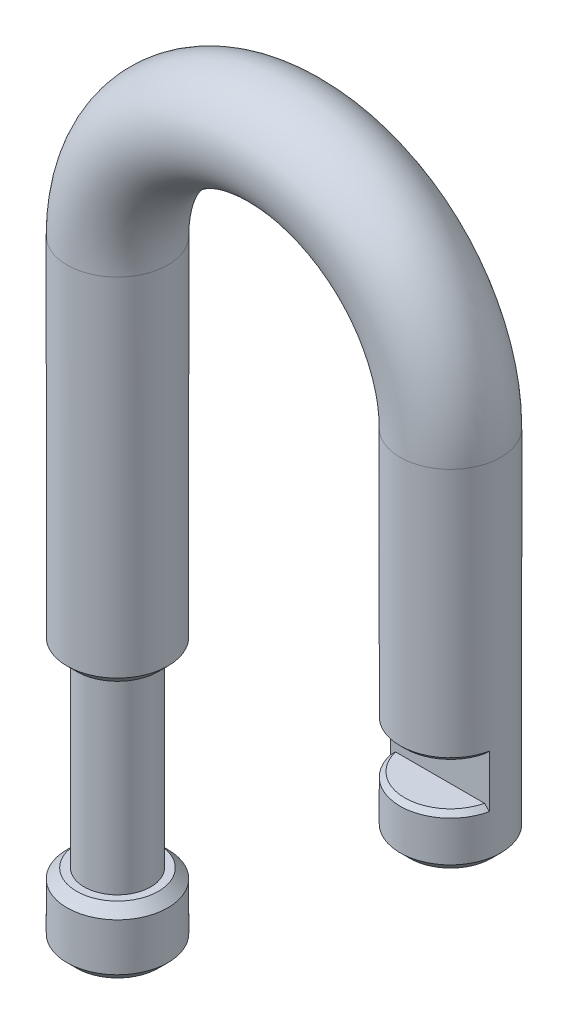
ISO-10303-21;
HEADER;
FILE_DESCRIPTION(('STEP AP214'),'2;1');
FILE_NAME('part.step','',(''),(''),'','','');
FILE_SCHEMA(('AUTOMOTIVE_DESIGN { 1 0 10303 214 1 1 1 1 }'));
ENDSEC;
DATA;
#1=APPLICATION_CONTEXT('core data for automotive mechanical design processes');
#2=APPLICATION_PROTOCOL_DEFINITION('international standard','automotive_design',2000,#1);
#3=PRODUCT_CONTEXT('',#1,'mechanical');
#4=PRODUCT('Part','Part','',(#3));
#5=PRODUCT_RELATED_PRODUCT_CATEGORY('part','',(#4));
#6=PRODUCT_DEFINITION_FORMATION('','',#4);
#7=PRODUCT_DEFINITION_CONTEXT('part definition',#1,'design');
#8=PRODUCT_DEFINITION('design','',#6,#7);
#9=PRODUCT_DEFINITION_SHAPE('','',#8);
#10=(LENGTH_UNIT() NAMED_UNIT(*) SI_UNIT(.MILLI.,.METRE.));
#11=(NAMED_UNIT(*) PLANE_ANGLE_UNIT() SI_UNIT($,.RADIAN.));
#12=(NAMED_UNIT(*) SI_UNIT($,.STERADIAN.) SOLID_ANGLE_UNIT());
#13=UNCERTAINTY_MEASURE_WITH_UNIT(LENGTH_MEASURE(1.E-05),#10,'distance_accuracy_value','');
#14=(GEOMETRIC_REPRESENTATION_CONTEXT(3) GLOBAL_UNCERTAINTY_ASSIGNED_CONTEXT((#13)) GLOBAL_UNIT_ASSIGNED_CONTEXT((#10,
#11,#12)) REPRESENTATION_CONTEXT('',''));
#15=CARTESIAN_POINT('',(0.,0.,0.));
#16=DIRECTION('',(0.,0.,1.));
#17=DIRECTION('',(1.,0.,0.));
#18=AXIS2_PLACEMENT_3D('',#15,#16,#17);
#19=CARTESIAN_POINT('',(0.,0.,0.));
#20=DIRECTION('',(0.,1.,0.));
#21=DIRECTION('',(-1.,0.,0.));
#22=AXIS2_PLACEMENT_3D('',#19,#20,#21);
#23=CYLINDRICAL_SURFACE('',#22,5.3);
#24=CARTESIAN_POINT('',(0.,28.,0.));
#25=DIRECTION('',(0.,-1.,0.));
#26=DIRECTION('',(1.,0.,0.));
#27=AXIS2_PLACEMENT_3D('',#24,#25,#26);
#28=CIRCLE('',#27,5.3);
#29=CARTESIAN_POINT('',(5.29999999999999,28.,0.));
#30=VERTEX_POINT('',#29);
#31=EDGE_CURVE('E163',#30,#30,#28,.F.);
#32=ORIENTED_EDGE('',*,*,#31,.T.);
#33=EDGE_LOOP('',(#32));
#34=FACE_BOUND('',#33,.T.);
#35=CARTESIAN_POINT('',(0.,64.5,0.));
#36=DIRECTION('',(0.,1.,0.));
#37=DIRECTION('',(0.,0.,1.));
#38=AXIS2_PLACEMENT_3D('',#35,#36,#37);
#39=CIRCLE('',#38,5.3);
#40=CARTESIAN_POINT('',(-5.30000000000001,64.5,0.));
#41=VERTEX_POINT('',#40);
#42=EDGE_CURVE('E130',#41,#41,#39,.T.);
#43=ORIENTED_EDGE('',*,*,#42,.F.);
#44=EDGE_LOOP('',(#43));
#45=FACE_BOUND('',#44,.T.);
#46=ADVANCED_FACE('F46',(#34,#45),#23,.T.);
#47=CARTESIAN_POINT('',(35.,64.5,0.));
#48=DIRECTION('',(0.,-1.,0.));
#49=DIRECTION('',(1.,0.,0.));
#50=AXIS2_PLACEMENT_3D('',#47,#48,#49);
#51=CYLINDRICAL_SURFACE('',#50,5.3);
#52=CARTESIAN_POINT('',(35.,28.5,0.));
#53=DIRECTION('',(0.,-1.,0.));
#54=DIRECTION('',(0.,0.,-1.));
#55=AXIS2_PLACEMENT_3D('',#52,#53,#54);
#56=CIRCLE('',#55,5.3);
#57=CARTESIAN_POINT('',(35.,28.5,-5.3));
#58=VERTEX_POINT('',#57);
#59=EDGE_CURVE('E143',#58,#58,#56,.F.);
#60=ORIENTED_EDGE('',*,*,#59,.T.);
#61=EDGE_LOOP('',(#60));
#62=FACE_BOUND('',#61,.T.);
#63=CARTESIAN_POINT('',(35.,64.5,0.));
#64=DIRECTION('',(0.,-1.,0.));
#65=DIRECTION('',(0.,0.,1.));
#66=AXIS2_PLACEMENT_3D('',#63,#64,#65);
#67=CIRCLE('',#66,5.3);
#68=CARTESIAN_POINT('',(40.3,64.5,0.));
#69=VERTEX_POINT('',#68);
#70=EDGE_CURVE('E135',#69,#69,#67,.T.);
#71=ORIENTED_EDGE('',*,*,#70,.T.);
#72=EDGE_LOOP('',(#71));
#73=FACE_BOUND('',#72,.T.);
#74=DIRECTION('',(0.,-1.,0.));
#75=VECTOR('',#74,1.);
#76=CARTESIAN_POINT('',(29.8154074412737,37.7499999999999,1.1));
#77=LINE('',#76,#75);
#78=CARTESIAN_POINT('',(29.8154074412737,38.2499999999999,1.1));
#79=VERTEX_POINT('',#78);
#80=CARTESIAN_POINT('',(29.8154074412737,32.7499999999999,1.1));
#81=VERTEX_POINT('',#80);
#82=EDGE_CURVE('E121',#79,#81,#77,.T.);
#83=ORIENTED_EDGE('',*,*,#82,.F.);
#84=CARTESIAN_POINT('',(35.,38.2499999999999,0.));
#85=DIRECTION('',(0.,-1.,0.));
#86=DIRECTION('',(0.,0.,-1.));
#87=AXIS2_PLACEMENT_3D('',#84,#85,#86);
#88=CIRCLE('',#87,5.3);
#89=CARTESIAN_POINT('',(40.1845925587263,38.2499999999999,1.1));
#90=VERTEX_POINT('',#89);
#91=EDGE_CURVE('E101',#79,#90,#88,.F.);
#92=ORIENTED_EDGE('',*,*,#91,.T.);
#93=DIRECTION('',(0.,-1.,0.));
#94=VECTOR('',#93,1.);
#95=CARTESIAN_POINT('',(40.1845925587263,37.7499999999999,1.1));
#96=LINE('',#95,#94);
#97=CARTESIAN_POINT('',(40.1845925587263,32.7499999999999,1.1));
#98=VERTEX_POINT('',#97);
#99=EDGE_CURVE('E116',#90,#98,#96,.T.);
#100=ORIENTED_EDGE('',*,*,#99,.T.);
#101=CARTESIAN_POINT('',(35.,32.7499999999999,0.));
#102=DIRECTION('',(0.,-1.,0.));
#103=DIRECTION('',(0.,0.,-1.));
#104=AXIS2_PLACEMENT_3D('',#101,#102,#103);
#105=CIRCLE('',#104,5.3);
#106=EDGE_CURVE('E111',#98,#81,#105,.T.);
#107=ORIENTED_EDGE('',*,*,#106,.T.);
#108=EDGE_LOOP('',(#83,#92,#100,#107));
#109=FACE_BOUND('',#108,.T.);
#110=ADVANCED_FACE('F233',(#62,#73,#109),#51,.T.);
#111=CARTESIAN_POINT('',(35.,27.5,0.));
#112=DIRECTION('',(0.,-1.,0.));
#113=DIRECTION('',(0.,0.,1.));
#114=AXIS2_PLACEMENT_3D('',#111,#112,#113);
#115=PLANE('',#114);
#116=CARTESIAN_POINT('',(35.,27.5,0.));
#117=DIRECTION('',(0.,-1.,0.));
#118=DIRECTION('',(1.,0.,0.));
#119=AXIS2_PLACEMENT_3D('',#116,#117,#118);
#120=CIRCLE('',#119,4.29999999999999);
#121=CARTESIAN_POINT('',(39.3,27.5,0.));
#122=VERTEX_POINT('',#121);
#123=EDGE_CURVE('E139',#122,#122,#120,.T.);
#124=ORIENTED_EDGE('',*,*,#123,.T.);
#125=EDGE_LOOP('',(#124));
#126=FACE_BOUND('',#125,.T.);
#127=ADVANCED_FACE('F229',(#126),#115,.T.);
#128=CARTESIAN_POINT('',(17.5,64.5,0.));
#129=DIRECTION('',(0.,0.,-1.));
#130=DIRECTION('',(-1.,0.,0.));
#131=AXIS2_PLACEMENT_3D('',#128,#129,#130);
#132=TOROIDAL_SURFACE('',#131,17.5,5.3);
#133=CARTESIAN_POINT('',(17.5,64.5,0.));
#134=DIRECTION('',(0.,0.,-1.));
#135=DIRECTION('',(-1.,0.,0.));
#136=AXIS2_PLACEMENT_3D('',#133,#134,#135);
#137=CIRCLE('',#136,22.8);
#138=EDGE_CURVE('',#41,#69,#137,.T.);
#139=ORIENTED_EDGE('',*,*,#42,.T.);
#140=ORIENTED_EDGE('',*,*,#70,.F.);
#141=ORIENTED_EDGE('',*,*,#138,.T.);
#142=ORIENTED_EDGE('',*,*,#138,.F.);
#143=EDGE_LOOP('',(#139,#141,#140,#142));
#144=FACE_BOUND('',#143,.T.);
#145=ADVANCED_FACE('F232',(#144),#132,.T.);
#146=CARTESIAN_POINT('',(0.,37.75,1.1));
#147=DIRECTION('',(0.,0.,-1.));
#148=DIRECTION('',(-1.,0.,0.));
#149=AXIS2_PLACEMENT_3D('',#146,#147,#148);
#150=PLANE('',#149);
#151=ORIENTED_EDGE('',*,*,#82,.T.);
#152=CARTESIAN_POINT('',(29.8154074412737,32.7499999999999,1.1));
#153=CARTESIAN_POINT('',(29.9006934499817,32.8334388627094,1.1));
#154=CARTESIAN_POINT('',(29.9860309538806,32.9168249599442,1.1));
#155=CARTESIAN_POINT('',(30.156808955289,33.0834916266148,1.1));
#156=CARTESIAN_POINT('',(30.2422494528023,33.1667721960468,1.1));
#157=CARTESIAN_POINT('',(30.3277414455105,33.2499999999999,1.1));
#158=B_SPLINE_CURVE_WITH_KNOTS('',3,(#152,#153,#154,#155,#156,#157),.UNSPECIFIED.,.F.,.F.,(4,2,
4),(0.,0.35794074517115,0.715881503875867),.UNSPECIFIED.);
#159=CARTESIAN_POINT('',(30.3277414455105,33.2499999999999,1.1));
#160=VERTEX_POINT('',#159);
#161=EDGE_CURVE('E62',#81,#160,#158,.T.);
#162=ORIENTED_EDGE('',*,*,#161,.T.);
#163=DIRECTION('',(1.,0.,0.));
#164=VECTOR('',#163,1.);
#165=CARTESIAN_POINT('',(0.,33.25,1.1));
#166=LINE('',#165,#164);
#167=CARTESIAN_POINT('',(39.6722585544895,33.2499999999999,1.1));
#168=VERTEX_POINT('',#167);
#169=EDGE_CURVE('E117',#160,#168,#166,.T.);
#170=ORIENTED_EDGE('',*,*,#169,.T.);
#171=CARTESIAN_POINT('',(39.6722585544895,33.2499999999999,1.1));
#172=CARTESIAN_POINT('',(39.7577505471977,33.1667721960468,1.1));
#173=CARTESIAN_POINT('',(39.843191044711,33.0834916266148,1.1));
#174=CARTESIAN_POINT('',(40.0139690461194,32.9168249599442,1.1));
#175=CARTESIAN_POINT('',(40.0993065500183,32.8334388627094,1.1));
#176=CARTESIAN_POINT('',(40.1845925587263,32.7499999999999,1.1));
#177=B_SPLINE_CURVE_WITH_KNOTS('',3,(#171,#172,#173,#174,#175,#176),.UNSPECIFIED.,.F.,.F.,(4,2,
4),(0.,0.357940758704703,0.715881503875852),.UNSPECIFIED.);
#178=EDGE_CURVE('E11',#168,#98,#177,.T.);
#179=ORIENTED_EDGE('',*,*,#178,.T.);
#180=ORIENTED_EDGE('',*,*,#99,.F.);
#181=CARTESIAN_POINT('',(40.1845925587263,38.2499999999999,1.09999999999999));
#182=CARTESIAN_POINT('',(40.0993065500183,38.1665611372904,1.1));
#183=CARTESIAN_POINT('',(40.0139690461194,38.0831750400557,1.1));
#184=CARTESIAN_POINT('',(39.843191044711,37.916508373385,1.1));
#185=CARTESIAN_POINT('',(39.7577505471977,37.8332278039531,1.1));
#186=CARTESIAN_POINT('',(39.6722585544895,37.7499999999999,1.1));
#187=B_SPLINE_CURVE_WITH_KNOTS('',3,(#181,#182,#183,#184,#185,#186),.UNSPECIFIED.,.F.,.F.,(4,2,
4),(0.,0.357940745171125,0.715881503875813),.UNSPECIFIED.);
#188=CARTESIAN_POINT('',(39.6722585544895,37.7499999999999,1.1));
#189=VERTEX_POINT('',#188);
#190=EDGE_CURVE('E104',#90,#189,#187,.T.);
#191=ORIENTED_EDGE('',*,*,#190,.T.);
#192=DIRECTION('',(1.,0.,0.));
#193=VECTOR('',#192,1.);
#194=CARTESIAN_POINT('',(0.,37.75,1.1));
#195=LINE('',#194,#193);
#196=CARTESIAN_POINT('',(30.3277414455105,37.7499999999999,1.1));
#197=VERTEX_POINT('',#196);
#198=EDGE_CURVE('E109',#197,#189,#195,.T.);
#199=ORIENTED_EDGE('',*,*,#198,.F.);
#200=CARTESIAN_POINT('',(30.3277414455105,37.7499999999999,1.1));
#201=CARTESIAN_POINT('',(30.2422494528023,37.8332278039531,1.1));
#202=CARTESIAN_POINT('',(30.156808955289,37.916508373385,1.1));
#203=CARTESIAN_POINT('',(29.9860309538806,38.0831750400557,1.1));
#204=CARTESIAN_POINT('',(29.9006934499817,38.1665611372904,1.1));
#205=CARTESIAN_POINT('',(29.8154074412737,38.2499999999999,1.1));
#206=B_SPLINE_CURVE_WITH_KNOTS('',3,(#200,#201,#202,#203,#204,#205),.UNSPECIFIED.,.F.,.F.,(4,2,
4),(0.,0.357940758704681,0.715881503875804),.UNSPECIFIED.);
#207=EDGE_CURVE('E95',#197,#79,#206,.T.);
#208=ORIENTED_EDGE('',*,*,#207,.T.);
#209=EDGE_LOOP('',(#151,#162,#170,#179,#180,#191,#199,#208));
#210=FACE_BOUND('',#209,.T.);
#211=ADVANCED_FACE('F114',(#210),#150,.F.);
#212=CARTESIAN_POINT('',(0.,37.75,0.));
#213=DIRECTION('',(0.,-1.,0.));
#214=DIRECTION('',(1.,0.,0.));
#215=AXIS2_PLACEMENT_3D('',#212,#213,#214);
#216=PLANE('',#215);
#217=ORIENTED_EDGE('',*,*,#198,.T.);
#218=CARTESIAN_POINT('',(35.,37.7499999999999,0.));
#219=DIRECTION('',(0.,-1.,0.));
#220=DIRECTION('',(1.,0.,0.));
#221=AXIS2_PLACEMENT_3D('',#218,#219,#220);
#222=CIRCLE('',#221,4.80000000000004);
#223=EDGE_CURVE('E99',#189,#197,#222,.T.);
#224=ORIENTED_EDGE('',*,*,#223,.T.);
#225=EDGE_LOOP('',(#217,#224));
#226=FACE_BOUND('',#225,.T.);
#227=ADVANCED_FACE('F108',(#226),#216,.T.);
#228=CARTESIAN_POINT('',(0.,33.25,0.));
#229=DIRECTION('',(0.,-1.,0.));
#230=DIRECTION('',(1.,0.,0.));
#231=AXIS2_PLACEMENT_3D('',#228,#229,#230);
#232=PLANE('',#231);
#233=ORIENTED_EDGE('',*,*,#169,.F.);
#234=CARTESIAN_POINT('',(35.,33.2499999999999,0.));
#235=DIRECTION('',(0.,-1.,0.));
#236=DIRECTION('',(1.,0.,0.));
#237=AXIS2_PLACEMENT_3D('',#234,#235,#236);
#238=CIRCLE('',#237,4.80000000000001);
#239=EDGE_CURVE('E68',#160,#168,#238,.F.);
#240=ORIENTED_EDGE('',*,*,#239,.T.);
#241=EDGE_LOOP('',(#233,#240));
#242=FACE_BOUND('',#241,.T.);
#243=ADVANCED_FACE('F273',(#242),#232,.F.);
#244=CARTESIAN_POINT('',(0.,27.,0.));
#245=DIRECTION('',(0.,-1.,0.));
#246=DIRECTION('',(0.,0.,-1.));
#247=AXIS2_PLACEMENT_3D('',#244,#245,#246);
#248=PLANE('',#247);
#249=CARTESIAN_POINT('',(0.,27.,0.));
#250=DIRECTION('',(0.,-1.,0.));
#251=DIRECTION('',(0.,0.,-1.));
#252=AXIS2_PLACEMENT_3D('',#249,#250,#251);
#253=CIRCLE('',#252,4.29999999999998);
#254=CARTESIAN_POINT('',(0.,27.,-4.29999999999998));
#255=VERTEX_POINT('',#254);
#256=EDGE_CURVE('E112',#255,#255,#253,.T.);
#257=ORIENTED_EDGE('',*,*,#256,.T.);
#258=EDGE_LOOP('',(#257));
#259=FACE_BOUND('',#258,.T.);
#260=CARTESIAN_POINT('',(0.,27.,0.));
#261=DIRECTION('',(0.,-1.,0.));
#262=DIRECTION('',(0.,0.,-1.));
#263=AXIS2_PLACEMENT_3D('',#260,#261,#262);
#264=CIRCLE('',#263,3.5);
#265=CARTESIAN_POINT('',(0.,27.,-3.5));
#266=VERTEX_POINT('',#265);
#267=EDGE_CURVE('E123',#266,#266,#264,.T.);
#268=ORIENTED_EDGE('',*,*,#267,.F.);
#269=EDGE_LOOP('',(#268));
#270=FACE_BOUND('',#269,.T.);
#271=ADVANCED_FACE('F269',(#259,#270),#248,.T.);
#272=CARTESIAN_POINT('',(0.,7.,0.));
#273=DIRECTION('',(0.,-1.,0.));
#274=DIRECTION('',(0.,0.,-1.));
#275=AXIS2_PLACEMENT_3D('',#272,#273,#274);
#276=PLANE('',#275);
#277=CARTESIAN_POINT('',(0.,7.,0.));
#278=DIRECTION('',(0.,-1.,0.));
#279=DIRECTION('',(0.,0.,-1.));
#280=AXIS2_PLACEMENT_3D('',#277,#278,#279);
#281=CIRCLE('',#280,4.29999999999999);
#282=CARTESIAN_POINT('',(0.,7.,-4.29999999999999));
#283=VERTEX_POINT('',#282);
#284=EDGE_CURVE('E159',#283,#283,#281,.F.);
#285=ORIENTED_EDGE('',*,*,#284,.T.);
#286=EDGE_LOOP('',(#285));
#287=FACE_BOUND('',#286,.T.);
#288=CARTESIAN_POINT('',(0.,7.,0.));
#289=DIRECTION('',(0.,-1.,0.));
#290=DIRECTION('',(0.,0.,-1.));
#291=AXIS2_PLACEMENT_3D('',#288,#289,#290);
#292=CIRCLE('',#291,3.5);
#293=CARTESIAN_POINT('',(0.,7.,-3.5));
#294=VERTEX_POINT('',#293);
#295=EDGE_CURVE('E126',#294,#294,#292,.T.);
#296=ORIENTED_EDGE('',*,*,#295,.T.);
#297=EDGE_LOOP('',(#296));
#298=FACE_BOUND('',#297,.T.);
#299=ADVANCED_FACE('F272',(#287,#298),#276,.F.);
#300=CARTESIAN_POINT('',(0.,27.,0.));
#301=DIRECTION('',(0.,-1.,0.));
#302=DIRECTION('',(0.,0.,-1.));
#303=AXIS2_PLACEMENT_3D('',#300,#301,#302);
#304=CYLINDRICAL_SURFACE('',#303,3.5);
#305=ORIENTED_EDGE('',*,*,#267,.T.);
#306=EDGE_LOOP('',(#305));
#307=FACE_BOUND('',#306,.T.);
#308=ORIENTED_EDGE('',*,*,#295,.F.);
#309=EDGE_LOOP('',(#308));
#310=FACE_BOUND('',#309,.T.);
#311=ADVANCED_FACE('F227',(#307,#310),#304,.T.);
#312=CARTESIAN_POINT('',(0.,0.,0.));
#313=DIRECTION('',(0.,1.,0.));
#314=DIRECTION('',(0.,0.,1.));
#315=AXIS2_PLACEMENT_3D('',#312,#313,#314);
#316=PLANE('',#315);
#317=CARTESIAN_POINT('',(0.,0.,0.));
#318=DIRECTION('',(0.,1.,0.));
#319=DIRECTION('',(0.,0.,1.));
#320=AXIS2_PLACEMENT_3D('',#317,#318,#319);
#321=CIRCLE('',#320,4.30000000000001);
#322=CARTESIAN_POINT('',(0.,0.,4.30000000000001));
#323=VERTEX_POINT('',#322);
#324=EDGE_CURVE('E155',#323,#323,#321,.F.);
#325=ORIENTED_EDGE('',*,*,#324,.T.);
#326=EDGE_LOOP('',(#325));
#327=FACE_BOUND('',#326,.T.);
#328=ADVANCED_FACE('F224',(#327),#316,.F.);
#329=CARTESIAN_POINT('',(0.,0.999999999999982,0.));
#330=DIRECTION('',(0.,1.,0.));
#331=DIRECTION('',(-1.,0.,0.));
#332=AXIS2_PLACEMENT_3D('',#329,#330,#331);
#333=CIRCLE('',#332,5.3);
#334=CARTESIAN_POINT('',(-5.3,0.99999999999998,0.));
#335=VERTEX_POINT('',#334);
#336=EDGE_CURVE('E151',#335,#335,#333,.T.);
#337=ORIENTED_EDGE('',*,*,#336,.T.);
#338=EDGE_LOOP('',(#337));
#339=FACE_BOUND('',#338,.T.);
#340=CARTESIAN_POINT('',(0.,5.99999999999998,0.));
#341=DIRECTION('',(0.,-1.,0.));
#342=DIRECTION('',(1.,0.,0.));
#343=AXIS2_PLACEMENT_3D('',#340,#341,#342);
#344=CIRCLE('',#343,5.3);
#345=CARTESIAN_POINT('',(5.3,5.99999999999998,0.));
#346=VERTEX_POINT('',#345);
#347=EDGE_CURVE('E147',#346,#346,#344,.T.);
#348=ORIENTED_EDGE('',*,*,#347,.T.);
#349=EDGE_LOOP('',(#348));
#350=FACE_BOUND('',#349,.T.);
#351=ADVANCED_FACE('F222',(#339,#350),#23,.T.);
#352=CARTESIAN_POINT('',(35.,27.5,0.));
#353=DIRECTION('',(0.,1.,0.));
#354=DIRECTION('',(0.,0.,1.));
#355=AXIS2_PLACEMENT_3D('',#352,#353,#354);
#356=CONICAL_SURFACE('',#355,4.29999999999999,0.785398163397448);
#357=ORIENTED_EDGE('',*,*,#59,.F.);
#358=EDGE_LOOP('',(#357));
#359=FACE_BOUND('',#358,.T.);
#360=ORIENTED_EDGE('',*,*,#123,.F.);
#361=EDGE_LOOP('',(#360));
#362=FACE_BOUND('',#361,.T.);
#363=ADVANCED_FACE('F216',(#359,#362),#356,.T.);
#364=CARTESIAN_POINT('',(0.,0.999999999999982,0.));
#365=DIRECTION('',(0.,1.,0.));
#366=DIRECTION('',(-1.,0.,0.));
#367=AXIS2_PLACEMENT_3D('',#364,#365,#366);
#368=CONICAL_SURFACE('',#367,5.3,0.785398163397453);
#369=ORIENTED_EDGE('',*,*,#324,.F.);
#370=EDGE_LOOP('',(#369));
#371=FACE_BOUND('',#370,.T.);
#372=ORIENTED_EDGE('',*,*,#336,.F.);
#373=EDGE_LOOP('',(#372));
#374=FACE_BOUND('',#373,.T.);
#375=ADVANCED_FACE('F209',(#371,#374),#368,.T.);
#376=CARTESIAN_POINT('',(0.,7.,0.));
#377=DIRECTION('',(0.,-1.,0.));
#378=DIRECTION('',(1.,0.,0.));
#379=AXIS2_PLACEMENT_3D('',#376,#377,#378);
#380=CONICAL_SURFACE('',#379,4.29999999999999,0.785398163397443);
#381=ORIENTED_EDGE('',*,*,#347,.F.);
#382=EDGE_LOOP('',(#381));
#383=FACE_BOUND('',#382,.T.);
#384=ORIENTED_EDGE('',*,*,#284,.F.);
#385=EDGE_LOOP('',(#384));
#386=FACE_BOUND('',#385,.T.);
#387=ADVANCED_FACE('F202',(#383,#386),#380,.T.);
#388=CARTESIAN_POINT('',(0.,28.,0.));
#389=DIRECTION('',(0.,1.,0.));
#390=DIRECTION('',(-1.,0.,0.));
#391=AXIS2_PLACEMENT_3D('',#388,#389,#390);
#392=CONICAL_SURFACE('',#391,5.3,0.785398163397453);
#393=ORIENTED_EDGE('',*,*,#256,.F.);
#394=EDGE_LOOP('',(#393));
#395=FACE_BOUND('',#394,.T.);
#396=ORIENTED_EDGE('',*,*,#31,.F.);
#397=EDGE_LOOP('',(#396));
#398=FACE_BOUND('',#397,.T.);
#399=ADVANCED_FACE('F195',(#395,#398),#392,.T.);
#400=CARTESIAN_POINT('',(35.,37.7499999999999,0.));
#401=DIRECTION('',(0.,1.,0.));
#402=DIRECTION('',(0.,0.,1.));
#403=AXIS2_PLACEMENT_3D('',#400,#401,#402);
#404=CONICAL_SURFACE('',#403,4.80000000000003,0.785398163397435);
#405=ORIENTED_EDGE('',*,*,#190,.F.);
#406=ORIENTED_EDGE('',*,*,#91,.F.);
#407=ORIENTED_EDGE('',*,*,#207,.F.);
#408=ORIENTED_EDGE('',*,*,#223,.F.);
#409=EDGE_LOOP('',(#405,#406,#407,#408));
#410=FACE_BOUND('',#409,.T.);
#411=ADVANCED_FACE('F98',(#410),#404,.T.);
#412=CARTESIAN_POINT('',(35.,32.7499999999999,0.));
#413=DIRECTION('',(0.,-1.,0.));
#414=DIRECTION('',(0.,0.,-1.));
#415=AXIS2_PLACEMENT_3D('',#412,#413,#414);
#416=CONICAL_SURFACE('',#415,5.3,0.785398163397428);
#417=ORIENTED_EDGE('',*,*,#178,.F.);
#418=ORIENTED_EDGE('',*,*,#239,.F.);
#419=ORIENTED_EDGE('',*,*,#161,.F.);
#420=ORIENTED_EDGE('',*,*,#106,.F.);
#421=EDGE_LOOP('',(#417,#418,#419,#420));
#422=FACE_BOUND('',#421,.T.);
#423=ADVANCED_FACE('F49',(#422),#416,.T.);
#424=CLOSED_SHELL('',(#46,#110,#127,#145,#211,#227,#243,#271,#299,#311,#328,#351,#363,#375,#387,
#399,#411,#423));
#425=MANIFOLD_SOLID_BREP('B2',#424);
#426=ADVANCED_BREP_SHAPE_REPRESENTATION('',(#18,#425),#14);
#427=SHAPE_DEFINITION_REPRESENTATION(#9,#426);
ENDSEC;
END-ISO-10303-21;
